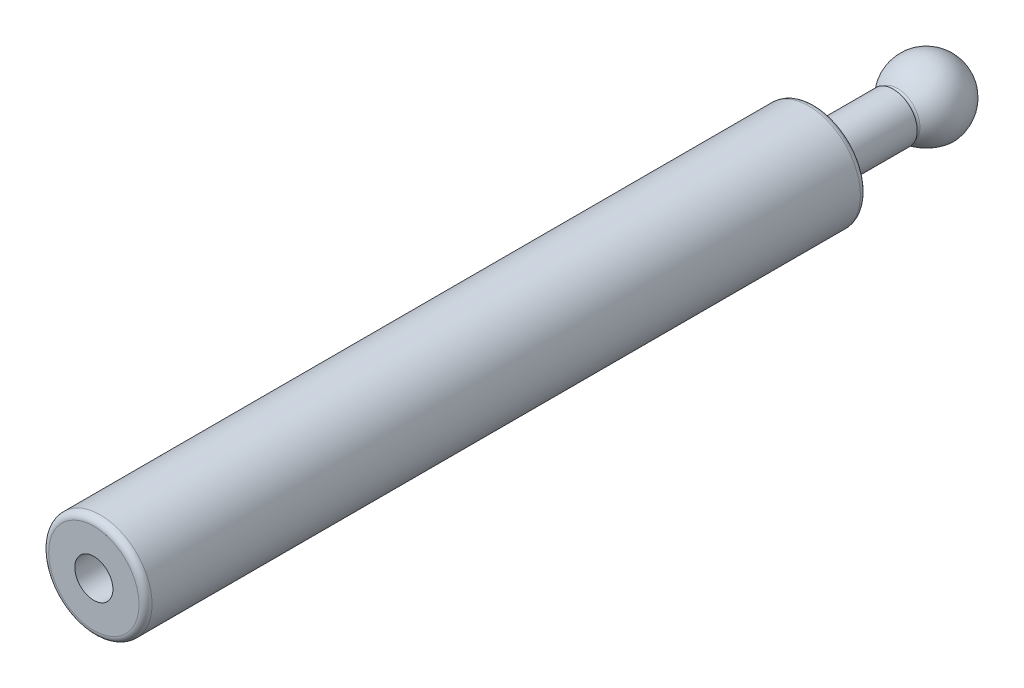
ISO-10303-21;
HEADER;
FILE_DESCRIPTION(('STEP AP214'),'2;1');
FILE_NAME('part.step','',(''),(''),'','','');
FILE_SCHEMA(('AUTOMOTIVE_DESIGN { 1 0 10303 214 1 1 1 1 }'));
ENDSEC;
DATA;
#1=APPLICATION_CONTEXT('core data for automotive mechanical design processes');
#2=APPLICATION_PROTOCOL_DEFINITION('international standard','automotive_design',2000,#1);
#3=PRODUCT_CONTEXT('',#1,'mechanical');
#4=PRODUCT('Part','Part','',(#3));
#5=PRODUCT_RELATED_PRODUCT_CATEGORY('part','',(#4));
#6=PRODUCT_DEFINITION_FORMATION('','',#4);
#7=PRODUCT_DEFINITION_CONTEXT('part definition',#1,'design');
#8=PRODUCT_DEFINITION('design','',#6,#7);
#9=PRODUCT_DEFINITION_SHAPE('','',#8);
#10=(LENGTH_UNIT() NAMED_UNIT(*) SI_UNIT(.MILLI.,.METRE.));
#11=(NAMED_UNIT(*) PLANE_ANGLE_UNIT() SI_UNIT($,.RADIAN.));
#12=(NAMED_UNIT(*) SI_UNIT($,.STERADIAN.) SOLID_ANGLE_UNIT());
#13=UNCERTAINTY_MEASURE_WITH_UNIT(LENGTH_MEASURE(1.E-05),#10,'distance_accuracy_value','');
#14=(GEOMETRIC_REPRESENTATION_CONTEXT(3) GLOBAL_UNCERTAINTY_ASSIGNED_CONTEXT((#13)) GLOBAL_UNIT_ASSIGNED_CONTEXT((#10,
#11,#12)) REPRESENTATION_CONTEXT('',''));
#15=CARTESIAN_POINT('',(0.,0.,0.));
#16=DIRECTION('',(0.,0.,1.));
#17=DIRECTION('',(1.,0.,0.));
#18=AXIS2_PLACEMENT_3D('',#15,#16,#17);
#19=CARTESIAN_POINT('',(0.,0.,-177.546));
#20=DIRECTION('',(0.,0.,-1.));
#21=DIRECTION('',(0.,1.,0.));
#22=AXIS2_PLACEMENT_3D('',#19,#20,#21);
#23=SPHERICAL_SURFACE('',#22,6.59999999999999);
#24=CARTESIAN_POINT('',(0.,0.,-177.546));
#25=DIRECTION('',(0.,-1.,0.));
#26=DIRECTION('',(0.,0.,-1.));
#27=AXIS2_PLACEMENT_3D('',#24,#25,#26);
#28=SPHERICAL_SURFACE('',#27,6.59999999999999);
#29=CARTESIAN_POINT('',(0.,0.,-177.546));
#30=DIRECTION('',(0.,-1.,0.));
#31=DIRECTION('',(0.,0.,-1.));
#32=AXIS2_PLACEMENT_3D('',#29,#30,#31);
#33=CIRCLE('',#32,6.59999999999999);
#34=CARTESIAN_POINT('',(0.,0.,-184.146));
#35=VERTEX_POINT('',#34);
#36=EDGE_CURVE('E68',#35,#35,#33,.T.);
#37=ORIENTED_EDGE('',*,*,#36,.T.);
#38=EDGE_LOOP('',(#37));
#39=FACE_BOUND('',#38,.T.);
#40=ADVANCED_FACE('F48',(#39),#28,.F.);
#41=CARTESIAN_POINT('',(0.,-6.50000000000002,-184.146));
#42=DIRECTION('',(0.,1.,0.));
#43=DIRECTION('',(0.,0.,1.));
#44=AXIS2_PLACEMENT_3D('',#41,#42,#43);
#45=PLANE('',#44);
#46=CARTESIAN_POINT('',(0.,-6.50000000000002,-177.546));
#47=DIRECTION('',(0.,-1.,0.));
#48=DIRECTION('',(0.,0.,-1.));
#49=AXIS2_PLACEMENT_3D('',#46,#47,#48);
#50=CIRCLE('',#49,6.59999999999999);
#51=CARTESIAN_POINT('',(0.,-6.50000000000002,-184.146));
#52=VERTEX_POINT('',#51);
#53=EDGE_CURVE('E63',#52,#52,#50,.T.);
#54=ORIENTED_EDGE('',*,*,#53,.F.);
#55=EDGE_LOOP('',(#54));
#56=FACE_BOUND('',#55,.T.);
#57=CARTESIAN_POINT('',(0.,-6.50000000000002,-177.546));
#58=DIRECTION('',(0.,-1.,0.));
#59=DIRECTION('',(0.,0.,-1.));
#60=AXIS2_PLACEMENT_3D('',#57,#58,#59);
#61=CIRCLE('',#60,7.47521477952304);
#62=CARTESIAN_POINT('',(0.,-6.50000000000002,-185.021214779523));
#63=VERTEX_POINT('',#62);
#64=EDGE_CURVE('E59',#63,#63,#61,.T.);
#65=ORIENTED_EDGE('',*,*,#64,.T.);
#66=EDGE_LOOP('',(#65));
#67=FACE_BOUND('',#66,.T.);
#68=ADVANCED_FACE('F113',(#56,#67),#45,.F.);
#69=CARTESIAN_POINT('',(0.,0.,-177.546));
#70=DIRECTION('',(0.,-1.,0.));
#71=DIRECTION('',(0.,0.,-1.));
#72=AXIS2_PLACEMENT_3D('',#69,#70,#71);
#73=CYLINDRICAL_SURFACE('',#72,6.59999999999999);
#74=ORIENTED_EDGE('',*,*,#36,.F.);
#75=EDGE_LOOP('',(#74));
#76=FACE_BOUND('',#75,.T.);
#77=ORIENTED_EDGE('',*,*,#53,.T.);
#78=EDGE_LOOP('',(#77));
#79=FACE_BOUND('',#78,.T.);
#80=ADVANCED_FACE('F119',(#76,#79),#73,.F.);
#81=CARTESIAN_POINT('',(0.,0.,-147.546));
#82=DIRECTION('',(0.,0.,-1.));
#83=DIRECTION('',(0.,1.,0.));
#84=AXIS2_PLACEMENT_3D('',#81,#82,#83);
#85=CYLINDRICAL_SURFACE('',#84,6.5);
#86=CARTESIAN_POINT('',(0.,0.,-147.546));
#87=DIRECTION('',(0.,0.,1.));
#88=DIRECTION('',(1.,0.,0.));
#89=AXIS2_PLACEMENT_3D('',#86,#87,#88);
#90=CIRCLE('',#89,6.5);
#91=CARTESIAN_POINT('',(6.5,0.,-147.546));
#92=VERTEX_POINT('',#91);
#93=EDGE_CURVE('E71',#92,#92,#90,.F.);
#94=ORIENTED_EDGE('',*,*,#93,.T.);
#95=EDGE_LOOP('',(#94));
#96=FACE_BOUND('',#95,.T.);
#97=CARTESIAN_POINT('',(0.,0.,-168.612645886081));
#98=DIRECTION('',(0.,0.,-1.));
#99=DIRECTION('',(0.,1.,0.));
#100=AXIS2_PLACEMENT_3D('',#97,#98,#99);
#101=CIRCLE('',#100,6.5);
#102=CARTESIAN_POINT('',(0.,6.49999999999998,-168.612645886081));
#103=VERTEX_POINT('',#102);
#104=EDGE_CURVE('E12',#103,#103,#101,.T.);
#105=ORIENTED_EDGE('',*,*,#104,.F.);
#106=EDGE_LOOP('',(#105));
#107=FACE_BOUND('',#106,.T.);
#108=ADVANCED_FACE('F50',(#96,#107),#85,.T.);
#109=CARTESIAN_POINT('',(0.,0.,-169.247645886081));
#110=DIRECTION('',(0.,0.,-1.));
#111=DIRECTION('',(0.,1.,0.));
#112=AXIS2_PLACEMENT_3D('',#109,#110,#111);
#113=TOROIDAL_SURFACE('',#112,6.5,0.635);
#114=ORIENTED_EDGE('',*,*,#104,.T.);
#115=EDGE_LOOP('',(#114));
#116=FACE_BOUND('',#115,.T.);
#117=CARTESIAN_POINT('',(0.,0.,-169.747546736317));
#118=DIRECTION('',(0.,0.,-1.));
#119=DIRECTION('',(0.,1.,0.));
#120=AXIS2_PLACEMENT_3D('',#117,#118,#119);
#121=CIRCLE('',#120,6.10843373493976);
#122=CARTESIAN_POINT('',(0.,6.10843373493974,-169.747546736317));
#123=VERTEX_POINT('',#122);
#124=EDGE_CURVE('E55',#123,#123,#121,.T.);
#125=ORIENTED_EDGE('',*,*,#124,.F.);
#126=EDGE_LOOP('',(#125));
#127=FACE_BOUND('',#126,.T.);
#128=ADVANCED_FACE('F126',(#116,#127),#113,.F.);
#129=CARTESIAN_POINT('',(0.,0.,-177.546));
#130=DIRECTION('',(0.,0.,-1.));
#131=DIRECTION('',(0.,1.,0.));
#132=AXIS2_PLACEMENT_3D('',#129,#130,#131);
#133=SPHERICAL_SURFACE('',#132,9.906);
#134=ORIENTED_EDGE('',*,*,#64,.F.);
#135=EDGE_LOOP('',(#134));
#136=FACE_BOUND('',#135,.T.);
#137=ORIENTED_EDGE('',*,*,#124,.T.);
#138=EDGE_LOOP('',(#137));
#139=FACE_BOUND('',#138,.T.);
#140=ADVANCED_FACE('F124',(#136,#139),#133,.T.);
#141=CARTESIAN_POINT('',(0.,0.,-147.546));
#142=DIRECTION('',(0.,0.,1.));
#143=DIRECTION('',(1.,0.,0.));
#144=AXIS2_PLACEMENT_3D('',#141,#142,#143);
#145=PLANE('',#144);
#146=ORIENTED_EDGE('',*,*,#93,.F.);
#147=EDGE_LOOP('',(#146));
#148=FACE_BOUND('',#147,.T.);
#149=CARTESIAN_POINT('',(0.,0.,-147.546));
#150=DIRECTION('',(0.,0.,1.));
#151=DIRECTION('',(1.,0.,0.));
#152=AXIS2_PLACEMENT_3D('',#149,#150,#151);
#153=CIRCLE('',#152,12.206);
#154=CARTESIAN_POINT('',(12.206,0.,-147.546));
#155=VERTEX_POINT('',#154);
#156=EDGE_CURVE('E77',#155,#155,#153,.F.);
#157=ORIENTED_EDGE('',*,*,#156,.T.);
#158=EDGE_LOOP('',(#157));
#159=FACE_BOUND('',#158,.T.);
#160=ADVANCED_FACE('F109',(#148,#159),#145,.F.);
#161=CARTESIAN_POINT('',(0.,0.,177.546));
#162=DIRECTION('',(0.,0.,1.));
#163=DIRECTION('',(1.,0.,0.));
#164=AXIS2_PLACEMENT_3D('',#161,#162,#163);
#165=CYLINDRICAL_SURFACE('',#164,13.97);
#166=CARTESIAN_POINT('',(0.,0.,-145.782));
#167=DIRECTION('',(0.,0.,1.));
#168=DIRECTION('',(1.,0.,0.));
#169=AXIS2_PLACEMENT_3D('',#166,#167,#168);
#170=CIRCLE('',#169,13.97);
#171=CARTESIAN_POINT('',(13.97,0.,-145.782));
#172=VERTEX_POINT('',#171);
#173=EDGE_CURVE('E80',#172,#172,#170,.T.);
#174=ORIENTED_EDGE('',*,*,#173,.T.);
#175=EDGE_LOOP('',(#174));
#176=FACE_BOUND('',#175,.T.);
#177=CARTESIAN_POINT('',(0.,0.,45.706));
#178=DIRECTION('',(0.,0.,-1.));
#179=DIRECTION('',(-1.,0.,0.));
#180=AXIS2_PLACEMENT_3D('',#177,#178,#179);
#181=CIRCLE('',#180,13.97);
#182=CARTESIAN_POINT('',(-13.97,0.,45.706));
#183=VERTEX_POINT('',#182);
#184=EDGE_CURVE('E83',#183,#183,#181,.T.);
#185=ORIENTED_EDGE('',*,*,#184,.T.);
#186=EDGE_LOOP('',(#185));
#187=FACE_BOUND('',#186,.T.);
#188=ADVANCED_FACE('F103',(#176,#187),#165,.T.);
#189=CARTESIAN_POINT('',(0.,5.15,47.47));
#190=DIRECTION('',(0.,0.,-1.));
#191=DIRECTION('',(-1.,0.,0.));
#192=AXIS2_PLACEMENT_3D('',#189,#190,#191);
#193=PLANE('',#192);
#194=CARTESIAN_POINT('',(0.,0.,47.47));
#195=DIRECTION('',(0.,0.,-1.));
#196=DIRECTION('',(-1.,0.,0.));
#197=AXIS2_PLACEMENT_3D('',#194,#195,#196);
#198=CIRCLE('',#197,12.206);
#199=CARTESIAN_POINT('',(-12.206,0.,47.47));
#200=VERTEX_POINT('',#199);
#201=EDGE_CURVE('E74',#200,#200,#198,.F.);
#202=ORIENTED_EDGE('',*,*,#201,.T.);
#203=EDGE_LOOP('',(#202));
#204=FACE_BOUND('',#203,.T.);
#205=CARTESIAN_POINT('',(0.,0.,47.47));
#206=DIRECTION('',(0.,0.,1.));
#207=DIRECTION('',(1.,0.,0.));
#208=AXIS2_PLACEMENT_3D('',#205,#206,#207);
#209=CIRCLE('',#208,5.15);
#210=CARTESIAN_POINT('',(5.15,0.,47.47));
#211=VERTEX_POINT('',#210);
#212=EDGE_CURVE('E86',#211,#211,#209,.T.);
#213=ORIENTED_EDGE('',*,*,#212,.F.);
#214=EDGE_LOOP('',(#213));
#215=FACE_BOUND('',#214,.T.);
#216=ADVANCED_FACE('F98',(#204,#215),#193,.F.);
#217=CARTESIAN_POINT('',(0.,0.,177.546));
#218=DIRECTION('',(0.,0.,1.));
#219=DIRECTION('',(1.,0.,0.));
#220=AXIS2_PLACEMENT_3D('',#217,#218,#219);
#221=CYLINDRICAL_SURFACE('',#220,5.15);
#222=CARTESIAN_POINT('',(0.,0.,-85.906));
#223=DIRECTION('',(0.,0.,1.));
#224=DIRECTION('',(1.,0.,0.));
#225=AXIS2_PLACEMENT_3D('',#222,#223,#224);
#226=CIRCLE('',#225,5.15);
#227=CARTESIAN_POINT('',(5.15,0.,-85.906));
#228=VERTEX_POINT('',#227);
#229=EDGE_CURVE('E89',#228,#228,#226,.T.);
#230=ORIENTED_EDGE('',*,*,#229,.F.);
#231=EDGE_LOOP('',(#230));
#232=FACE_BOUND('',#231,.T.);
#233=ORIENTED_EDGE('',*,*,#212,.T.);
#234=EDGE_LOOP('',(#233));
#235=FACE_BOUND('',#234,.T.);
#236=ADVANCED_FACE('F95',(#232,#235),#221,.F.);
#237=CARTESIAN_POINT('',(0.,5.15,-85.906));
#238=DIRECTION('',(0.,0.,-1.));
#239=DIRECTION('',(-1.,0.,0.));
#240=AXIS2_PLACEMENT_3D('',#237,#238,#239);
#241=PLANE('',#240);
#242=ORIENTED_EDGE('',*,*,#229,.T.);
#243=EDGE_LOOP('',(#242));
#244=FACE_BOUND('',#243,.T.);
#245=ADVANCED_FACE('F93',(#244),#241,.F.);
#246=CARTESIAN_POINT('',(0.,0.,-145.782));
#247=DIRECTION('',(0.,0.,1.));
#248=DIRECTION('',(1.,0.,0.));
#249=AXIS2_PLACEMENT_3D('',#246,#247,#248);
#250=TOROIDAL_SURFACE('',#249,12.206,1.764);
#251=ORIENTED_EDGE('',*,*,#156,.F.);
#252=EDGE_LOOP('',(#251));
#253=FACE_BOUND('',#252,.T.);
#254=ORIENTED_EDGE('',*,*,#173,.F.);
#255=EDGE_LOOP('',(#254));
#256=FACE_BOUND('',#255,.T.);
#257=ADVANCED_FACE('F146',(#253,#256),#250,.T.);
#258=CARTESIAN_POINT('',(0.,0.,45.706));
#259=DIRECTION('',(0.,0.,-1.));
#260=DIRECTION('',(-1.,0.,0.));
#261=AXIS2_PLACEMENT_3D('',#258,#259,#260);
#262=TOROIDAL_SURFACE('',#261,12.206,1.764);
#263=ORIENTED_EDGE('',*,*,#184,.F.);
#264=EDGE_LOOP('',(#263));
#265=FACE_BOUND('',#264,.T.);
#266=ORIENTED_EDGE('',*,*,#201,.F.);
#267=EDGE_LOOP('',(#266));
#268=FACE_BOUND('',#267,.T.);
#269=ADVANCED_FACE('F149',(#265,#268),#262,.T.);
#270=CLOSED_SHELL('',(#40,#68,#80,#108,#128,#140,#160,#188,#216,#236,#245,#257,#269));
#271=MANIFOLD_SOLID_BREP('B2',#270);
#272=ADVANCED_BREP_SHAPE_REPRESENTATION('',(#18,#271),#14);
#273=SHAPE_DEFINITION_REPRESENTATION(#9,#272);
ENDSEC;
END-ISO-10303-21;
